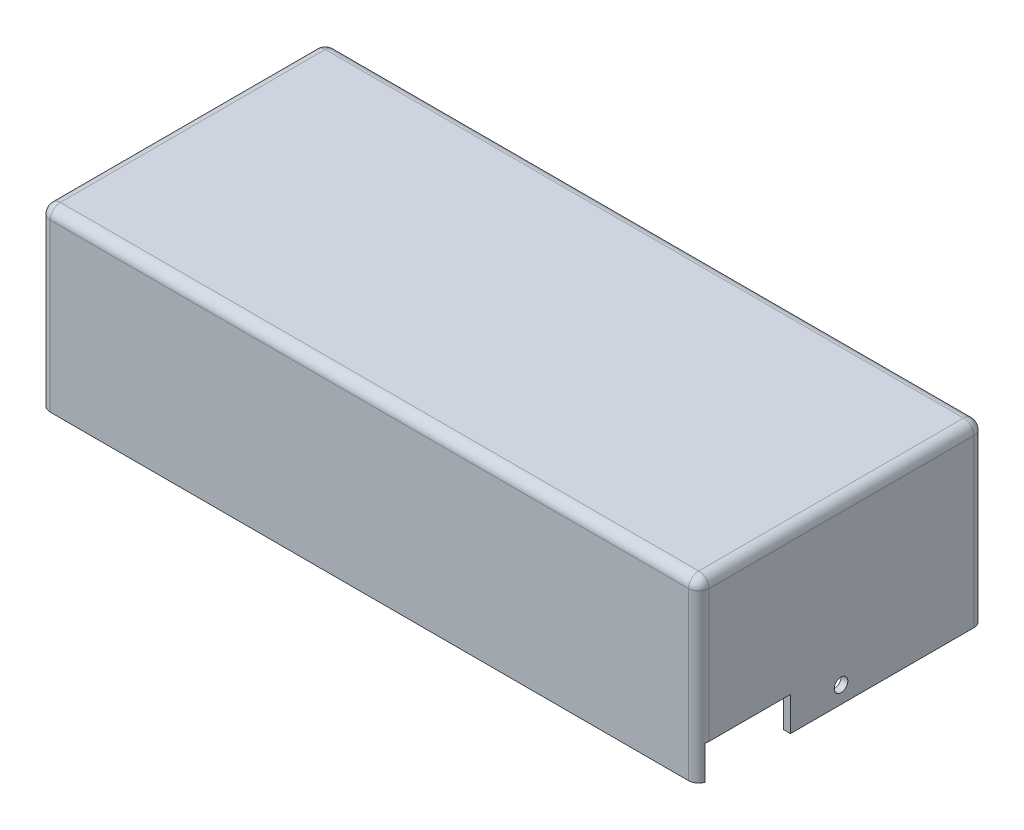
ISO-10303-21;
HEADER;
FILE_DESCRIPTION(('STEP AP214'),'2;1');
FILE_NAME('part.step','',(''),(''),'','','');
FILE_SCHEMA(('AUTOMOTIVE_DESIGN { 1 0 10303 214 1 1 1 1 }'));
ENDSEC;
DATA;
#1=APPLICATION_CONTEXT('core data for automotive mechanical design processes');
#2=APPLICATION_PROTOCOL_DEFINITION('international standard','automotive_design',2000,#1);
#3=PRODUCT_CONTEXT('',#1,'mechanical');
#4=PRODUCT('Part','Part','',(#3));
#5=PRODUCT_RELATED_PRODUCT_CATEGORY('part','',(#4));
#6=PRODUCT_DEFINITION_FORMATION('','',#4);
#7=PRODUCT_DEFINITION_CONTEXT('part definition',#1,'design');
#8=PRODUCT_DEFINITION('design','',#6,#7);
#9=PRODUCT_DEFINITION_SHAPE('','',#8);
#10=(LENGTH_UNIT() NAMED_UNIT(*) SI_UNIT(.MILLI.,.METRE.));
#11=(NAMED_UNIT(*) PLANE_ANGLE_UNIT() SI_UNIT($,.RADIAN.));
#12=(NAMED_UNIT(*) SI_UNIT($,.STERADIAN.) SOLID_ANGLE_UNIT());
#13=UNCERTAINTY_MEASURE_WITH_UNIT(LENGTH_MEASURE(1.E-05),#10,'distance_accuracy_value','');
#14=(GEOMETRIC_REPRESENTATION_CONTEXT(3) GLOBAL_UNCERTAINTY_ASSIGNED_CONTEXT((#13)) GLOBAL_UNIT_ASSIGNED_CONTEXT((#10,
#11,#12)) REPRESENTATION_CONTEXT('',''));
#15=CARTESIAN_POINT('',(0.,0.,0.));
#16=DIRECTION('',(0.,0.,1.));
#17=DIRECTION('',(1.,0.,0.));
#18=AXIS2_PLACEMENT_3D('',#15,#16,#17);
#19=CARTESIAN_POINT('',(0.,0.,84.));
#20=DIRECTION('',(1.,0.,0.));
#21=DIRECTION('',(0.,0.,-1.));
#22=AXIS2_PLACEMENT_3D('',#19,#20,#21);
#23=PLANE('',#22);
#24=CARTESIAN_POINT('',(0.,5.,41.8927201313068));
#25=DIRECTION('',(-1.,0.,0.));
#26=DIRECTION('',(0.,0.,1.));
#27=AXIS2_PLACEMENT_3D('',#24,#25,#26);
#28=CIRCLE('',#27,1.99999999999999);
#29=CARTESIAN_POINT('',(0.,5.,43.8927201313068));
#30=VERTEX_POINT('',#29);
#31=EDGE_CURVE('E431',#30,#30,#28,.T.);
#32=ORIENTED_EDGE('',*,*,#31,.F.);
#33=EDGE_LOOP('',(#32));
#34=FACE_BOUND('',#33,.T.);
#35=DIRECTION('',(0.,0.,-1.));
#36=VECTOR('',#35,1.);
#37=CARTESIAN_POINT('',(0.,49.,84.));
#38=LINE('',#37,#36);
#39=CARTESIAN_POINT('',(0.,49.,81.));
#40=VERTEX_POINT('',#39);
#41=CARTESIAN_POINT('',(0.,49.,3.));
#42=VERTEX_POINT('',#41);
#43=EDGE_CURVE('E71',#40,#42,#38,.T.);
#44=ORIENTED_EDGE('',*,*,#43,.T.);
#45=DIRECTION('',(0.,-1.,0.));
#46=VECTOR('',#45,1.);
#47=CARTESIAN_POINT('',(0.,0.,3.));
#48=LINE('',#47,#46);
#49=CARTESIAN_POINT('',(0.,0.,3.00000000000003));
#50=VERTEX_POINT('',#49);
#51=EDGE_CURVE('E400',#42,#50,#48,.T.);
#52=ORIENTED_EDGE('',*,*,#51,.T.);
#53=DIRECTION('',(0.,0.,-1.));
#54=VECTOR('',#53,1.);
#55=CARTESIAN_POINT('',(0.,0.,84.));
#56=LINE('',#55,#54);
#57=CARTESIAN_POINT('',(0.,0.,81.));
#58=VERTEX_POINT('',#57);
#59=EDGE_CURVE('E253',#58,#50,#56,.T.);
#60=ORIENTED_EDGE('',*,*,#59,.F.);
#61=DIRECTION('',(0.,-1.,0.));
#62=VECTOR('',#61,1.);
#63=CARTESIAN_POINT('',(0.,0.,81.));
#64=LINE('',#63,#62);
#65=EDGE_CURVE('E360',#58,#40,#64,.F.);
#66=ORIENTED_EDGE('',*,*,#65,.T.);
#67=EDGE_LOOP('',(#44,#52,#60,#66));
#68=FACE_BOUND('',#67,.T.);
#69=ADVANCED_FACE('F46',(#34,#68),#23,.F.);
#70=CARTESIAN_POINT('',(0.,0.,84.));
#71=DIRECTION('',(0.,1.,0.));
#72=DIRECTION('',(0.,0.,1.));
#73=AXIS2_PLACEMENT_3D('',#70,#71,#72);
#74=PLANE('',#73);
#75=DIRECTION('',(0.,0.,-1.));
#76=VECTOR('',#75,1.);
#77=CARTESIAN_POINT('',(194.,0.,84.));
#78=LINE('',#77,#76);
#79=CARTESIAN_POINT('',(194.,0.,57.));
#80=VERTEX_POINT('',#79);
#81=CARTESIAN_POINT('',(194.,0.,3.00000000000003));
#82=VERTEX_POINT('',#81);
#83=EDGE_CURVE('E249',#80,#82,#78,.T.);
#84=ORIENTED_EDGE('',*,*,#83,.F.);
#85=DIRECTION('',(1.,0.,0.));
#86=VECTOR('',#85,1.);
#87=CARTESIAN_POINT('',(189.,0.,57.));
#88=LINE('',#87,#86);
#89=CARTESIAN_POINT('',(192.,0.,57.));
#90=VERTEX_POINT('',#89);
#91=EDGE_CURVE('E214',#90,#80,#88,.T.);
#92=ORIENTED_EDGE('',*,*,#91,.F.);
#93=DIRECTION('',(0.,0.,1.));
#94=VECTOR('',#93,1.);
#95=CARTESIAN_POINT('',(192.,0.,2.));
#96=LINE('',#95,#94);
#97=CARTESIAN_POINT('',(192.,0.,3.));
#98=VERTEX_POINT('',#97);
#99=EDGE_CURVE('E234',#98,#90,#96,.T.);
#100=ORIENTED_EDGE('',*,*,#99,.F.);
#101=CARTESIAN_POINT('',(191.,0.,3.));
#102=DIRECTION('',(0.,1.,0.));
#103=DIRECTION('',(0.,0.,1.));
#104=AXIS2_PLACEMENT_3D('',#101,#102,#103);
#105=CIRCLE('',#104,1.);
#106=CARTESIAN_POINT('',(191.,0.,2.));
#107=VERTEX_POINT('',#106);
#108=EDGE_CURVE('E324',#98,#107,#105,.T.);
#109=ORIENTED_EDGE('',*,*,#108,.T.);
#110=DIRECTION('',(1.,0.,0.));
#111=VECTOR('',#110,1.);
#112=CARTESIAN_POINT('',(192.,0.,2.));
#113=LINE('',#112,#111);
#114=CARTESIAN_POINT('',(3.,0.,1.99999999999998));
#115=VERTEX_POINT('',#114);
#116=EDGE_CURVE('E242',#115,#107,#113,.T.);
#117=ORIENTED_EDGE('',*,*,#116,.F.);
#118=CARTESIAN_POINT('',(3.,0.,2.99999999999998));
#119=DIRECTION('',(0.,1.,0.));
#120=DIRECTION('',(0.,0.,1.));
#121=AXIS2_PLACEMENT_3D('',#118,#119,#120);
#122=CIRCLE('',#121,1.);
#123=CARTESIAN_POINT('',(2.,0.,2.99999999999998));
#124=VERTEX_POINT('',#123);
#125=EDGE_CURVE('E272',#115,#124,#122,.T.);
#126=ORIENTED_EDGE('',*,*,#125,.T.);
#127=DIRECTION('',(0.,0.,-1.));
#128=VECTOR('',#127,1.);
#129=CARTESIAN_POINT('',(2.,0.,1.99999999999998));
#130=LINE('',#129,#128);
#131=CARTESIAN_POINT('',(2.,0.,81.));
#132=VERTEX_POINT('',#131);
#133=EDGE_CURVE('E240',#132,#124,#130,.T.);
#134=ORIENTED_EDGE('',*,*,#133,.F.);
#135=CARTESIAN_POINT('',(3.,0.,81.));
#136=DIRECTION('',(0.,1.,0.));
#137=DIRECTION('',(0.,0.,1.));
#138=AXIS2_PLACEMENT_3D('',#135,#136,#137);
#139=CIRCLE('',#138,1.);
#140=CARTESIAN_POINT('',(3.,0.,82.));
#141=VERTEX_POINT('',#140);
#142=EDGE_CURVE('E296',#132,#141,#139,.T.);
#143=ORIENTED_EDGE('',*,*,#142,.T.);
#144=DIRECTION('',(-1.,0.,0.));
#145=VECTOR('',#144,1.);
#146=CARTESIAN_POINT('',(192.,0.,82.));
#147=LINE('',#146,#145);
#148=CARTESIAN_POINT('',(193.828427124746,0.,82.));
#149=VERTEX_POINT('',#148);
#150=EDGE_CURVE('E237',#149,#141,#147,.T.);
#151=ORIENTED_EDGE('',*,*,#150,.F.);
#152=CARTESIAN_POINT('',(191.,0.,81.));
#153=DIRECTION('',(0.,1.,0.));
#154=DIRECTION('',(0.,0.,1.));
#155=AXIS2_PLACEMENT_3D('',#152,#153,#154);
#156=CIRCLE('',#155,3.);
#157=CARTESIAN_POINT('',(191.,0.,84.));
#158=VERTEX_POINT('',#157);
#159=EDGE_CURVE('E357',#149,#158,#156,.F.);
#160=ORIENTED_EDGE('',*,*,#159,.T.);
#161=DIRECTION('',(1.,0.,0.));
#162=VECTOR('',#161,1.);
#163=CARTESIAN_POINT('',(0.,0.,84.));
#164=LINE('',#163,#162);
#165=CARTESIAN_POINT('',(3.,0.,84.));
#166=VERTEX_POINT('',#165);
#167=EDGE_CURVE('E246',#166,#158,#164,.T.);
#168=ORIENTED_EDGE('',*,*,#167,.F.);
#169=CARTESIAN_POINT('',(3.,0.,81.));
#170=DIRECTION('',(0.,1.,0.));
#171=DIRECTION('',(0.,0.,1.));
#172=AXIS2_PLACEMENT_3D('',#169,#170,#171);
#173=CIRCLE('',#172,3.);
#174=EDGE_CURVE('E355',#166,#58,#173,.F.);
#175=ORIENTED_EDGE('',*,*,#174,.T.);
#176=ORIENTED_EDGE('',*,*,#59,.T.);
#177=CARTESIAN_POINT('',(3.,0.,3.));
#178=DIRECTION('',(0.,1.,0.));
#179=DIRECTION('',(0.,0.,1.));
#180=AXIS2_PLACEMENT_3D('',#177,#178,#179);
#181=CIRCLE('',#180,3.);
#182=CARTESIAN_POINT('',(3.,0.,0.));
#183=VERTEX_POINT('',#182);
#184=EDGE_CURVE('E389',#50,#183,#181,.F.);
#185=ORIENTED_EDGE('',*,*,#184,.T.);
#186=DIRECTION('',(1.,0.,0.));
#187=VECTOR('',#186,1.);
#188=CARTESIAN_POINT('',(0.,0.,0.));
#189=LINE('',#188,#187);
#190=CARTESIAN_POINT('',(191.,0.,0.));
#191=VERTEX_POINT('',#190);
#192=EDGE_CURVE('E245',#183,#191,#189,.T.);
#193=ORIENTED_EDGE('',*,*,#192,.T.);
#194=CARTESIAN_POINT('',(191.,0.,3.));
#195=DIRECTION('',(0.,1.,0.));
#196=DIRECTION('',(0.,0.,1.));
#197=AXIS2_PLACEMENT_3D('',#194,#195,#196);
#198=CIRCLE('',#197,3.);
#199=EDGE_CURVE('E391',#191,#82,#198,.F.);
#200=ORIENTED_EDGE('',*,*,#199,.T.);
#201=EDGE_LOOP('',(#84,#92,#100,#109,#117,#126,#134,#143,#151,#160,#168,#175,#176,#185,#193,#200));
#202=FACE_BOUND('',#201,.T.);
#203=ADVANCED_FACE('F440',(#202),#74,.F.);
#204=CARTESIAN_POINT('',(194.,0.,84.));
#205=DIRECTION('',(-1.,0.,0.));
#206=DIRECTION('',(0.,0.,1.));
#207=AXIS2_PLACEMENT_3D('',#204,#205,#206);
#208=PLANE('',#207);
#209=CARTESIAN_POINT('',(194.,5.,42.1072798686932));
#210=DIRECTION('',(1.,0.,0.));
#211=DIRECTION('',(0.,0.,-1.));
#212=AXIS2_PLACEMENT_3D('',#209,#210,#211);
#213=CIRCLE('',#212,2.);
#214=CARTESIAN_POINT('',(194.,5.,40.1072798686932));
#215=VERTEX_POINT('',#214);
#216=EDGE_CURVE('E424',#215,#215,#213,.T.);
#217=ORIENTED_EDGE('',*,*,#216,.F.);
#218=EDGE_LOOP('',(#217));
#219=FACE_BOUND('',#218,.T.);
#220=DIRECTION('',(0.,0.,1.));
#221=VECTOR('',#220,1.);
#222=CARTESIAN_POINT('',(194.,10.,57.));
#223=LINE('',#222,#221);
#224=CARTESIAN_POINT('',(194.,10.,57.));
#225=VERTEX_POINT('',#224);
#226=CARTESIAN_POINT('',(194.,10.,81.));
#227=VERTEX_POINT('',#226);
#228=EDGE_CURVE('E63',#225,#227,#223,.T.);
#229=ORIENTED_EDGE('',*,*,#228,.F.);
#230=DIRECTION('',(0.,1.,0.));
#231=VECTOR('',#230,1.);
#232=CARTESIAN_POINT('',(194.,0.,57.));
#233=LINE('',#232,#231);
#234=EDGE_CURVE('E211',#80,#225,#233,.T.);
#235=ORIENTED_EDGE('',*,*,#234,.F.);
#236=ORIENTED_EDGE('',*,*,#83,.T.);
#237=DIRECTION('',(0.,1.,0.));
#238=VECTOR('',#237,1.);
#239=CARTESIAN_POINT('',(194.,49.,3.));
#240=LINE('',#239,#238);
#241=CARTESIAN_POINT('',(194.,49.,3.));
#242=VERTEX_POINT('',#241);
#243=EDGE_CURVE('E379',#82,#242,#240,.T.);
#244=ORIENTED_EDGE('',*,*,#243,.T.);
#245=DIRECTION('',(0.,0.,-1.));
#246=VECTOR('',#245,1.);
#247=CARTESIAN_POINT('',(194.,49.,84.));
#248=LINE('',#247,#246);
#249=CARTESIAN_POINT('',(194.,49.,81.));
#250=VERTEX_POINT('',#249);
#251=EDGE_CURVE('E345',#242,#250,#248,.F.);
#252=ORIENTED_EDGE('',*,*,#251,.T.);
#253=DIRECTION('',(0.,1.,0.));
#254=VECTOR('',#253,1.);
#255=CARTESIAN_POINT('',(194.,0.,81.));
#256=LINE('',#255,#254);
#257=EDGE_CURVE('E222',#250,#227,#256,.F.);
#258=ORIENTED_EDGE('',*,*,#257,.T.);
#259=EDGE_LOOP('',(#229,#235,#236,#244,#252,#258));
#260=FACE_BOUND('',#259,.T.);
#261=ADVANCED_FACE('F220',(#219,#260),#208,.F.);
#262=CARTESIAN_POINT('',(0.,52.,84.));
#263=DIRECTION('',(0.,-1.,0.));
#264=DIRECTION('',(0.,0.,-1.));
#265=AXIS2_PLACEMENT_3D('',#262,#263,#264);
#266=PLANE('',#265);
#267=DIRECTION('',(0.,0.,-1.));
#268=VECTOR('',#267,1.);
#269=CARTESIAN_POINT('',(191.,52.,84.));
#270=LINE('',#269,#268);
#271=CARTESIAN_POINT('',(191.,52.,81.));
#272=VERTEX_POINT('',#271);
#273=CARTESIAN_POINT('',(191.,52.,3.));
#274=VERTEX_POINT('',#273);
#275=EDGE_CURVE('E340',#272,#274,#270,.T.);
#276=ORIENTED_EDGE('',*,*,#275,.T.);
#277=DIRECTION('',(-1.,0.,0.));
#278=VECTOR('',#277,1.);
#279=CARTESIAN_POINT('',(0.,52.,3.));
#280=LINE('',#279,#278);
#281=CARTESIAN_POINT('',(3.,52.,3.));
#282=VERTEX_POINT('',#281);
#283=EDGE_CURVE('E397',#274,#282,#280,.T.);
#284=ORIENTED_EDGE('',*,*,#283,.T.);
#285=DIRECTION('',(0.,0.,-1.));
#286=VECTOR('',#285,1.);
#287=CARTESIAN_POINT('',(3.,52.,84.));
#288=LINE('',#287,#286);
#289=CARTESIAN_POINT('',(3.,52.,81.));
#290=VERTEX_POINT('',#289);
#291=EDGE_CURVE('E395',#282,#290,#288,.F.);
#292=ORIENTED_EDGE('',*,*,#291,.T.);
#293=DIRECTION('',(-1.,0.,0.));
#294=VECTOR('',#293,1.);
#295=CARTESIAN_POINT('',(0.,52.,81.));
#296=LINE('',#295,#294);
#297=EDGE_CURVE('E326',#290,#272,#296,.F.);
#298=ORIENTED_EDGE('',*,*,#297,.T.);
#299=EDGE_LOOP('',(#276,#284,#292,#298));
#300=FACE_BOUND('',#299,.T.);
#301=ADVANCED_FACE('F586',(#300),#266,.F.);
#302=CARTESIAN_POINT('',(0.,0.,84.));
#303=DIRECTION('',(0.,0.,-1.));
#304=DIRECTION('',(-1.,0.,0.));
#305=AXIS2_PLACEMENT_3D('',#302,#303,#304);
#306=PLANE('',#305);
#307=ORIENTED_EDGE('',*,*,#167,.T.);
#308=DIRECTION('',(0.,1.,0.));
#309=VECTOR('',#308,1.);
#310=CARTESIAN_POINT('',(191.,0.,84.));
#311=LINE('',#310,#309);
#312=CARTESIAN_POINT('',(191.,49.,84.));
#313=VERTEX_POINT('',#312);
#314=EDGE_CURVE('E352',#158,#313,#311,.T.);
#315=ORIENTED_EDGE('',*,*,#314,.T.);
#316=DIRECTION('',(-1.,0.,0.));
#317=VECTOR('',#316,1.);
#318=CARTESIAN_POINT('',(0.,49.,84.));
#319=LINE('',#318,#317);
#320=CARTESIAN_POINT('',(3.,49.,84.));
#321=VERTEX_POINT('',#320);
#322=EDGE_CURVE('E347',#313,#321,#319,.T.);
#323=ORIENTED_EDGE('',*,*,#322,.T.);
#324=DIRECTION('',(0.,-1.,0.));
#325=VECTOR('',#324,1.);
#326=CARTESIAN_POINT('',(3.,0.,84.));
#327=LINE('',#326,#325);
#328=EDGE_CURVE('E350',#321,#166,#327,.T.);
#329=ORIENTED_EDGE('',*,*,#328,.T.);
#330=EDGE_LOOP('',(#307,#315,#323,#329));
#331=FACE_BOUND('',#330,.T.);
#332=ADVANCED_FACE('F560',(#331),#306,.F.);
#333=CARTESIAN_POINT('',(0.,0.,0.));
#334=DIRECTION('',(0.,0.,-1.));
#335=DIRECTION('',(-1.,0.,0.));
#336=AXIS2_PLACEMENT_3D('',#333,#334,#335);
#337=PLANE('',#336);
#338=DIRECTION('',(-1.,0.,0.));
#339=VECTOR('',#338,1.);
#340=CARTESIAN_POINT('',(191.,49.,0.));
#341=LINE('',#340,#339);
#342=CARTESIAN_POINT('',(3.,49.,0.));
#343=VERTEX_POINT('',#342);
#344=CARTESIAN_POINT('',(191.,49.,0.));
#345=VERTEX_POINT('',#344);
#346=EDGE_CURVE('E384',#343,#345,#341,.F.);
#347=ORIENTED_EDGE('',*,*,#346,.T.);
#348=DIRECTION('',(0.,1.,0.));
#349=VECTOR('',#348,1.);
#350=CARTESIAN_POINT('',(191.,0.,0.));
#351=LINE('',#350,#349);
#352=EDGE_CURVE('E386',#345,#191,#351,.F.);
#353=ORIENTED_EDGE('',*,*,#352,.T.);
#354=ORIENTED_EDGE('',*,*,#192,.F.);
#355=DIRECTION('',(0.,-1.,0.));
#356=VECTOR('',#355,1.);
#357=CARTESIAN_POINT('',(3.,52.,0.));
#358=LINE('',#357,#356);
#359=EDGE_CURVE('E382',#183,#343,#358,.F.);
#360=ORIENTED_EDGE('',*,*,#359,.T.);
#361=EDGE_LOOP('',(#347,#353,#354,#360));
#362=FACE_BOUND('',#361,.T.);
#363=ADVANCED_FACE('F575',(#362),#337,.T.);
#364=CARTESIAN_POINT('',(192.,50.,2.));
#365=DIRECTION('',(1.,0.,0.));
#366=DIRECTION('',(0.,0.,-1.));
#367=AXIS2_PLACEMENT_3D('',#364,#365,#366);
#368=PLANE('',#367);
#369=CARTESIAN_POINT('',(192.,5.,42.1072798686932));
#370=DIRECTION('',(1.,0.,0.));
#371=DIRECTION('',(0.,0.,-1.));
#372=AXIS2_PLACEMENT_3D('',#369,#370,#371);
#373=CIRCLE('',#372,2.);
#374=CARTESIAN_POINT('',(192.,5.,40.1072798686932));
#375=VERTEX_POINT('',#374);
#376=EDGE_CURVE('E217',#375,#375,#373,.T.);
#377=ORIENTED_EDGE('',*,*,#376,.T.);
#378=EDGE_LOOP('',(#377));
#379=FACE_BOUND('',#378,.T.);
#380=ORIENTED_EDGE('',*,*,#99,.T.);
#381=DIRECTION('',(0.,1.,0.));
#382=VECTOR('',#381,1.);
#383=CARTESIAN_POINT('',(192.,50.,57.));
#384=LINE('',#383,#382);
#385=CARTESIAN_POINT('',(192.,10.,57.));
#386=VERTEX_POINT('',#385);
#387=EDGE_CURVE('E11',#90,#386,#384,.T.);
#388=ORIENTED_EDGE('',*,*,#387,.T.);
#389=DIRECTION('',(0.,0.,1.));
#390=VECTOR('',#389,1.);
#391=CARTESIAN_POINT('',(192.,10.,1.99999999999999));
#392=LINE('',#391,#390);
#393=CARTESIAN_POINT('',(192.,10.,81.));
#394=VERTEX_POINT('',#393);
#395=EDGE_CURVE('E206',#386,#394,#392,.T.);
#396=ORIENTED_EDGE('',*,*,#395,.T.);
#397=DIRECTION('',(0.,-1.,0.));
#398=VECTOR('',#397,1.);
#399=CARTESIAN_POINT('',(192.,49.,81.));
#400=LINE('',#399,#398);
#401=CARTESIAN_POINT('',(192.,49.,81.));
#402=VERTEX_POINT('',#401);
#403=EDGE_CURVE('E299',#394,#402,#400,.F.);
#404=ORIENTED_EDGE('',*,*,#403,.T.);
#405=DIRECTION('',(0.,0.,1.));
#406=VECTOR('',#405,1.);
#407=CARTESIAN_POINT('',(192.,49.,2.));
#408=LINE('',#407,#406);
#409=CARTESIAN_POINT('',(192.,49.,3.));
#410=VERTEX_POINT('',#409);
#411=EDGE_CURVE('E307',#402,#410,#408,.F.);
#412=ORIENTED_EDGE('',*,*,#411,.T.);
#413=DIRECTION('',(0.,-1.,0.));
#414=VECTOR('',#413,1.);
#415=CARTESIAN_POINT('',(192.,0.,3.));
#416=LINE('',#415,#414);
#417=EDGE_CURVE('E309',#410,#98,#416,.T.);
#418=ORIENTED_EDGE('',*,*,#417,.T.);
#419=EDGE_LOOP('',(#380,#388,#396,#404,#412,#418));
#420=FACE_BOUND('',#419,.T.);
#421=ADVANCED_FACE('F602',(#379,#420),#368,.F.);
#422=CARTESIAN_POINT('',(192.,50.,2.));
#423=DIRECTION('',(0.,0.,-1.));
#424=DIRECTION('',(-1.,0.,0.));
#425=AXIS2_PLACEMENT_3D('',#422,#423,#424);
#426=PLANE('',#425);
#427=ORIENTED_EDGE('',*,*,#116,.T.);
#428=DIRECTION('',(0.,-1.,0.));
#429=VECTOR('',#428,1.);
#430=CARTESIAN_POINT('',(191.,49.,2.));
#431=LINE('',#430,#429);
#432=CARTESIAN_POINT('',(191.,49.,2.));
#433=VERTEX_POINT('',#432);
#434=EDGE_CURVE('E312',#107,#433,#431,.F.);
#435=ORIENTED_EDGE('',*,*,#434,.T.);
#436=DIRECTION('',(1.,0.,0.));
#437=VECTOR('',#436,1.);
#438=CARTESIAN_POINT('',(192.,49.,2.));
#439=LINE('',#438,#437);
#440=CARTESIAN_POINT('',(3.,49.,1.99999999999998));
#441=VERTEX_POINT('',#440);
#442=EDGE_CURVE('E264',#433,#441,#439,.F.);
#443=ORIENTED_EDGE('',*,*,#442,.T.);
#444=DIRECTION('',(0.,-1.,0.));
#445=VECTOR('',#444,1.);
#446=CARTESIAN_POINT('',(3.,0.,1.99999999999998));
#447=LINE('',#446,#445);
#448=EDGE_CURVE('E262',#441,#115,#447,.T.);
#449=ORIENTED_EDGE('',*,*,#448,.T.);
#450=EDGE_LOOP('',(#427,#435,#443,#449));
#451=FACE_BOUND('',#450,.T.);
#452=ADVANCED_FACE('F608',(#451),#426,.F.);
#453=CARTESIAN_POINT('',(2.,50.,1.99999999999998));
#454=DIRECTION('',(-1.,0.,0.));
#455=DIRECTION('',(0.,0.,1.));
#456=AXIS2_PLACEMENT_3D('',#453,#454,#455);
#457=PLANE('',#456);
#458=CARTESIAN_POINT('',(2.,5.,41.8927201313068));
#459=DIRECTION('',(-1.,0.,0.));
#460=DIRECTION('',(0.,0.,1.));
#461=AXIS2_PLACEMENT_3D('',#458,#459,#460);
#462=CIRCLE('',#461,1.99999999999999);
#463=CARTESIAN_POINT('',(2.,5.,43.8927201313068));
#464=VERTEX_POINT('',#463);
#465=EDGE_CURVE('E50',#464,#464,#462,.T.);
#466=ORIENTED_EDGE('',*,*,#465,.T.);
#467=EDGE_LOOP('',(#466));
#468=FACE_BOUND('',#467,.T.);
#469=DIRECTION('',(0.,0.,-1.));
#470=VECTOR('',#469,1.);
#471=CARTESIAN_POINT('',(2.,49.,1.99999999999998));
#472=LINE('',#471,#470);
#473=CARTESIAN_POINT('',(2.,49.,2.99999999999998));
#474=VERTEX_POINT('',#473);
#475=CARTESIAN_POINT('',(2.,49.,81.));
#476=VERTEX_POINT('',#475);
#477=EDGE_CURVE('E267',#474,#476,#472,.F.);
#478=ORIENTED_EDGE('',*,*,#477,.T.);
#479=DIRECTION('',(0.,-1.,0.));
#480=VECTOR('',#479,1.);
#481=CARTESIAN_POINT('',(2.,0.,81.));
#482=LINE('',#481,#480);
#483=EDGE_CURVE('E294',#476,#132,#482,.T.);
#484=ORIENTED_EDGE('',*,*,#483,.T.);
#485=ORIENTED_EDGE('',*,*,#133,.T.);
#486=DIRECTION('',(0.,-1.,0.));
#487=VECTOR('',#486,1.);
#488=CARTESIAN_POINT('',(2.,50.,2.99999999999998));
#489=LINE('',#488,#487);
#490=EDGE_CURVE('E270',#124,#474,#489,.F.);
#491=ORIENTED_EDGE('',*,*,#490,.T.);
#492=EDGE_LOOP('',(#478,#484,#485,#491));
#493=FACE_BOUND('',#492,.T.);
#494=ADVANCED_FACE('F629',(#468,#493),#457,.F.);
#495=CARTESIAN_POINT('',(192.,50.,82.));
#496=DIRECTION('',(0.,0.,1.));
#497=DIRECTION('',(1.,0.,0.));
#498=AXIS2_PLACEMENT_3D('',#495,#496,#497);
#499=PLANE('',#498);
#500=DIRECTION('',(0.,-1.,0.));
#501=VECTOR('',#500,1.);
#502=CARTESIAN_POINT('',(191.,0.,82.));
#503=LINE('',#502,#501);
#504=CARTESIAN_POINT('',(191.,49.,82.));
#505=VERTEX_POINT('',#504);
#506=CARTESIAN_POINT('',(191.,10.,82.));
#507=VERTEX_POINT('',#506);
#508=EDGE_CURVE('E321',#505,#507,#503,.T.);
#509=ORIENTED_EDGE('',*,*,#508,.T.);
#510=DIRECTION('',(1.,0.,0.));
#511=VECTOR('',#510,1.);
#512=CARTESIAN_POINT('',(189.,10.,82.));
#513=LINE('',#512,#511);
#514=CARTESIAN_POINT('',(193.828427124746,10.,82.));
#515=VERTEX_POINT('',#514);
#516=EDGE_CURVE('E208',#507,#515,#513,.T.);
#517=ORIENTED_EDGE('',*,*,#516,.T.);
#518=DIRECTION('',(0.,1.,0.));
#519=VECTOR('',#518,1.);
#520=CARTESIAN_POINT('',(193.828427124746,0.,82.));
#521=LINE('',#520,#519);
#522=EDGE_CURVE('E55',#515,#149,#521,.F.);
#523=ORIENTED_EDGE('',*,*,#522,.T.);
#524=ORIENTED_EDGE('',*,*,#150,.T.);
#525=DIRECTION('',(0.,-1.,0.));
#526=VECTOR('',#525,1.);
#527=CARTESIAN_POINT('',(3.,49.,82.));
#528=LINE('',#527,#526);
#529=CARTESIAN_POINT('',(3.,49.,82.));
#530=VERTEX_POINT('',#529);
#531=EDGE_CURVE('E287',#141,#530,#528,.F.);
#532=ORIENTED_EDGE('',*,*,#531,.T.);
#533=DIRECTION('',(-1.,0.,0.));
#534=VECTOR('',#533,1.);
#535=CARTESIAN_POINT('',(192.,49.,82.));
#536=LINE('',#535,#534);
#537=EDGE_CURVE('E289',#530,#505,#536,.F.);
#538=ORIENTED_EDGE('',*,*,#537,.T.);
#539=EDGE_LOOP('',(#509,#517,#523,#524,#532,#538));
#540=FACE_BOUND('',#539,.T.);
#541=ADVANCED_FACE('F590',(#540),#499,.F.);
#542=CARTESIAN_POINT('',(0.,50.,0.));
#543=DIRECTION('',(0.,-1.,0.));
#544=DIRECTION('',(0.,0.,-1.));
#545=AXIS2_PLACEMENT_3D('',#542,#543,#544);
#546=PLANE('',#545);
#547=DIRECTION('',(1.,0.,0.));
#548=VECTOR('',#547,1.);
#549=CARTESIAN_POINT('',(0.,50.,2.99999999999998));
#550=LINE('',#549,#548);
#551=CARTESIAN_POINT('',(3.,50.,2.99999999999998));
#552=VERTEX_POINT('',#551);
#553=CARTESIAN_POINT('',(191.,50.,3.));
#554=VERTEX_POINT('',#553);
#555=EDGE_CURVE('E258',#552,#554,#550,.T.);
#556=ORIENTED_EDGE('',*,*,#555,.T.);
#557=DIRECTION('',(0.,0.,1.));
#558=VECTOR('',#557,1.);
#559=CARTESIAN_POINT('',(191.,50.,0.));
#560=LINE('',#559,#558);
#561=CARTESIAN_POINT('',(191.,50.,81.));
#562=VERTEX_POINT('',#561);
#563=EDGE_CURVE('E317',#554,#562,#560,.T.);
#564=ORIENTED_EDGE('',*,*,#563,.T.);
#565=DIRECTION('',(-1.,0.,0.));
#566=VECTOR('',#565,1.);
#567=CARTESIAN_POINT('',(0.,50.,81.));
#568=LINE('',#567,#566);
#569=CARTESIAN_POINT('',(3.,50.,81.));
#570=VERTEX_POINT('',#569);
#571=EDGE_CURVE('E275',#562,#570,#568,.T.);
#572=ORIENTED_EDGE('',*,*,#571,.T.);
#573=DIRECTION('',(0.,0.,-1.));
#574=VECTOR('',#573,1.);
#575=CARTESIAN_POINT('',(3.,50.,0.));
#576=LINE('',#575,#574);
#577=EDGE_CURVE('E256',#570,#552,#576,.T.);
#578=ORIENTED_EDGE('',*,*,#577,.T.);
#579=EDGE_LOOP('',(#556,#564,#572,#578));
#580=FACE_BOUND('',#579,.T.);
#581=ADVANCED_FACE('F468',(#580),#546,.T.);
#582=CARTESIAN_POINT('',(3.,50.,2.99999999999998));
#583=DIRECTION('',(0.,1.,0.));
#584=DIRECTION('',(0.,0.,1.));
#585=AXIS2_PLACEMENT_3D('',#582,#583,#584);
#586=CYLINDRICAL_SURFACE('',#585,1.);
#587=ORIENTED_EDGE('',*,*,#125,.F.);
#588=ORIENTED_EDGE('',*,*,#448,.F.);
#589=CARTESIAN_POINT('',(3.,49.,2.99999999999998));
#590=DIRECTION('',(0.,-1.,0.));
#591=DIRECTION('',(0.,0.,-1.));
#592=AXIS2_PLACEMENT_3D('',#589,#590,#591);
#593=CIRCLE('',#592,1.);
#594=EDGE_CURVE('E238',#474,#441,#593,.T.);
#595=ORIENTED_EDGE('',*,*,#594,.F.);
#596=ORIENTED_EDGE('',*,*,#490,.F.);
#597=EDGE_LOOP('',(#587,#588,#595,#596));
#598=FACE_BOUND('',#597,.T.);
#599=ADVANCED_FACE('F464',(#598),#586,.F.);
#600=CARTESIAN_POINT('',(3.,49.,0.));
#601=DIRECTION('',(0.,0.,-1.));
#602=DIRECTION('',(-1.,0.,0.));
#603=AXIS2_PLACEMENT_3D('',#600,#601,#602);
#604=CYLINDRICAL_SURFACE('',#603,1.);
#605=ORIENTED_EDGE('',*,*,#577,.F.);
#606=CARTESIAN_POINT('',(3.,49.,81.));
#607=DIRECTION('',(0.,0.,-1.));
#608=DIRECTION('',(-1.,0.,0.));
#609=AXIS2_PLACEMENT_3D('',#606,#607,#608);
#610=CIRCLE('',#609,1.);
#611=EDGE_CURVE('E292',#570,#476,#610,.F.);
#612=ORIENTED_EDGE('',*,*,#611,.T.);
#613=ORIENTED_EDGE('',*,*,#477,.F.);
#614=CARTESIAN_POINT('',(3.,49.,2.99999999999998));
#615=DIRECTION('',(0.,0.,1.));
#616=DIRECTION('',(1.,0.,0.));
#617=AXIS2_PLACEMENT_3D('',#614,#615,#616);
#618=CIRCLE('',#617,1.);
#619=EDGE_CURVE('E280',#552,#474,#618,.T.);
#620=ORIENTED_EDGE('',*,*,#619,.F.);
#621=EDGE_LOOP('',(#605,#612,#613,#620));
#622=FACE_BOUND('',#621,.T.);
#623=ADVANCED_FACE('F460',(#622),#604,.F.);
#624=CARTESIAN_POINT('',(3.,49.,2.99999999999998));
#625=DIRECTION('',(0.,0.,1.));
#626=DIRECTION('',(1.,0.,0.));
#627=AXIS2_PLACEMENT_3D('',#624,#625,#626);
#628=SPHERICAL_SURFACE('',#627,1.);
#629=ORIENTED_EDGE('',*,*,#619,.T.);
#630=ORIENTED_EDGE('',*,*,#594,.T.);
#631=CARTESIAN_POINT('',(3.,49.,2.99999999999998));
#632=DIRECTION('',(1.,0.,0.));
#633=DIRECTION('',(0.,0.,-1.));
#634=AXIS2_PLACEMENT_3D('',#631,#632,#633);
#635=CIRCLE('',#634,1.);
#636=EDGE_CURVE('E276',#552,#441,#635,.F.);
#637=ORIENTED_EDGE('',*,*,#636,.F.);
#638=EDGE_LOOP('',(#629,#630,#637));
#639=FACE_BOUND('',#638,.T.);
#640=ADVANCED_FACE('F456',(#639),#628,.F.);
#641=CARTESIAN_POINT('',(0.,49.,2.99999999999998));
#642=DIRECTION('',(1.,0.,0.));
#643=DIRECTION('',(0.,0.,-1.));
#644=AXIS2_PLACEMENT_3D('',#641,#642,#643);
#645=CYLINDRICAL_SURFACE('',#644,1.);
#646=ORIENTED_EDGE('',*,*,#442,.F.);
#647=CARTESIAN_POINT('',(191.,49.,3.));
#648=DIRECTION('',(1.,0.,0.));
#649=DIRECTION('',(0.,0.,-1.));
#650=AXIS2_PLACEMENT_3D('',#647,#648,#649);
#651=CIRCLE('',#650,1.);
#652=EDGE_CURVE('E314',#433,#554,#651,.T.);
#653=ORIENTED_EDGE('',*,*,#652,.T.);
#654=ORIENTED_EDGE('',*,*,#555,.F.);
#655=ORIENTED_EDGE('',*,*,#636,.T.);
#656=EDGE_LOOP('',(#646,#653,#654,#655));
#657=FACE_BOUND('',#656,.T.);
#658=ADVANCED_FACE('F450',(#657),#645,.F.);
#659=CARTESIAN_POINT('',(3.,50.,81.));
#660=DIRECTION('',(0.,1.,0.));
#661=DIRECTION('',(0.,0.,1.));
#662=AXIS2_PLACEMENT_3D('',#659,#660,#661);
#663=CYLINDRICAL_SURFACE('',#662,1.);
#664=ORIENTED_EDGE('',*,*,#142,.F.);
#665=ORIENTED_EDGE('',*,*,#483,.F.);
#666=CARTESIAN_POINT('',(3.,49.,81.));
#667=DIRECTION('',(0.,-1.,0.));
#668=DIRECTION('',(0.,0.,-1.));
#669=AXIS2_PLACEMENT_3D('',#666,#667,#668);
#670=CIRCLE('',#669,1.);
#671=EDGE_CURVE('E281',#530,#476,#670,.T.);
#672=ORIENTED_EDGE('',*,*,#671,.F.);
#673=ORIENTED_EDGE('',*,*,#531,.F.);
#674=EDGE_LOOP('',(#664,#665,#672,#673));
#675=FACE_BOUND('',#674,.T.);
#676=ADVANCED_FACE('F455',(#675),#663,.F.);
#677=CARTESIAN_POINT('',(3.,49.,81.));
#678=DIRECTION('',(0.,0.,1.));
#679=DIRECTION('',(1.,0.,0.));
#680=AXIS2_PLACEMENT_3D('',#677,#678,#679);
#681=SPHERICAL_SURFACE('',#680,1.);
#682=ORIENTED_EDGE('',*,*,#671,.T.);
#683=ORIENTED_EDGE('',*,*,#611,.F.);
#684=CARTESIAN_POINT('',(3.,49.,81.));
#685=DIRECTION('',(-1.,0.,0.));
#686=DIRECTION('',(0.,0.,1.));
#687=AXIS2_PLACEMENT_3D('',#684,#685,#686);
#688=CIRCLE('',#687,1.);
#689=EDGE_CURVE('E300',#530,#570,#688,.T.);
#690=ORIENTED_EDGE('',*,*,#689,.F.);
#691=EDGE_LOOP('',(#682,#683,#690));
#692=FACE_BOUND('',#691,.T.);
#693=ADVANCED_FACE('F474',(#692),#681,.F.);
#694=CARTESIAN_POINT('',(0.,49.,81.));
#695=DIRECTION('',(-1.,0.,0.));
#696=DIRECTION('',(0.,0.,1.));
#697=AXIS2_PLACEMENT_3D('',#694,#695,#696);
#698=CYLINDRICAL_SURFACE('',#697,1.);
#699=ORIENTED_EDGE('',*,*,#571,.F.);
#700=CARTESIAN_POINT('',(191.,49.,81.));
#701=DIRECTION('',(-1.,0.,0.));
#702=DIRECTION('',(0.,0.,1.));
#703=AXIS2_PLACEMENT_3D('',#700,#701,#702);
#704=CIRCLE('',#703,1.);
#705=EDGE_CURVE('E319',#562,#505,#704,.F.);
#706=ORIENTED_EDGE('',*,*,#705,.T.);
#707=ORIENTED_EDGE('',*,*,#537,.F.);
#708=ORIENTED_EDGE('',*,*,#689,.T.);
#709=EDGE_LOOP('',(#699,#706,#707,#708));
#710=FACE_BOUND('',#709,.T.);
#711=ADVANCED_FACE('F470',(#710),#698,.F.);
#712=CARTESIAN_POINT('',(191.,50.,81.));
#713=DIRECTION('',(0.,1.,0.));
#714=DIRECTION('',(0.,0.,1.));
#715=AXIS2_PLACEMENT_3D('',#712,#713,#714);
#716=CYLINDRICAL_SURFACE('',#715,1.);
#717=ORIENTED_EDGE('',*,*,#403,.F.);
#718=CARTESIAN_POINT('',(191.,10.,81.));
#719=DIRECTION('',(0.,1.,0.));
#720=DIRECTION('',(0.,0.,1.));
#721=AXIS2_PLACEMENT_3D('',#718,#719,#720);
#722=CIRCLE('',#721,1.);
#723=EDGE_CURVE('E227',#394,#507,#722,.F.);
#724=ORIENTED_EDGE('',*,*,#723,.T.);
#725=ORIENTED_EDGE('',*,*,#508,.F.);
#726=CARTESIAN_POINT('',(191.,49.,81.));
#727=DIRECTION('',(0.,-1.,0.));
#728=DIRECTION('',(0.,0.,-1.));
#729=AXIS2_PLACEMENT_3D('',#726,#727,#728);
#730=CIRCLE('',#729,1.);
#731=EDGE_CURVE('E303',#402,#505,#730,.T.);
#732=ORIENTED_EDGE('',*,*,#731,.F.);
#733=EDGE_LOOP('',(#717,#724,#725,#732));
#734=FACE_BOUND('',#733,.T.);
#735=ADVANCED_FACE('F473',(#734),#716,.F.);
#736=CARTESIAN_POINT('',(191.,49.,81.));
#737=DIRECTION('',(1.,0.,0.));
#738=DIRECTION('',(0.,0.,-1.));
#739=AXIS2_PLACEMENT_3D('',#736,#737,#738);
#740=SPHERICAL_SURFACE('',#739,1.);
#741=ORIENTED_EDGE('',*,*,#731,.T.);
#742=ORIENTED_EDGE('',*,*,#705,.F.);
#743=CARTESIAN_POINT('',(191.,49.,81.));
#744=DIRECTION('',(0.,0.,1.));
#745=DIRECTION('',(1.,0.,0.));
#746=AXIS2_PLACEMENT_3D('',#743,#744,#745);
#747=CIRCLE('',#746,1.);
#748=EDGE_CURVE('E334',#402,#562,#747,.T.);
#749=ORIENTED_EDGE('',*,*,#748,.F.);
#750=EDGE_LOOP('',(#741,#742,#749));
#751=FACE_BOUND('',#750,.T.);
#752=ADVANCED_FACE('F494',(#751),#740,.F.);
#753=CARTESIAN_POINT('',(191.,49.,0.));
#754=DIRECTION('',(0.,0.,1.));
#755=DIRECTION('',(1.,0.,0.));
#756=AXIS2_PLACEMENT_3D('',#753,#754,#755);
#757=CYLINDRICAL_SURFACE('',#756,1.);
#758=ORIENTED_EDGE('',*,*,#748,.T.);
#759=ORIENTED_EDGE('',*,*,#563,.F.);
#760=CARTESIAN_POINT('',(191.,49.,3.));
#761=DIRECTION('',(0.,0.,1.));
#762=DIRECTION('',(1.,0.,0.));
#763=AXIS2_PLACEMENT_3D('',#760,#761,#762);
#764=CIRCLE('',#763,1.);
#765=EDGE_CURVE('E330',#410,#554,#764,.T.);
#766=ORIENTED_EDGE('',*,*,#765,.F.);
#767=ORIENTED_EDGE('',*,*,#411,.F.);
#768=EDGE_LOOP('',(#758,#759,#766,#767));
#769=FACE_BOUND('',#768,.T.);
#770=ADVANCED_FACE('F490',(#769),#757,.F.);
#771=CARTESIAN_POINT('',(191.,49.,3.));
#772=DIRECTION('',(1.,0.,0.));
#773=DIRECTION('',(0.,0.,-1.));
#774=AXIS2_PLACEMENT_3D('',#771,#772,#773);
#775=SPHERICAL_SURFACE('',#774,1.);
#776=ORIENTED_EDGE('',*,*,#765,.T.);
#777=ORIENTED_EDGE('',*,*,#652,.F.);
#778=CARTESIAN_POINT('',(191.,49.,3.));
#779=DIRECTION('',(0.,1.,0.));
#780=DIRECTION('',(0.,0.,1.));
#781=AXIS2_PLACEMENT_3D('',#778,#779,#780);
#782=CIRCLE('',#781,1.);
#783=EDGE_CURVE('E327',#410,#433,#782,.T.);
#784=ORIENTED_EDGE('',*,*,#783,.F.);
#785=EDGE_LOOP('',(#776,#777,#784));
#786=FACE_BOUND('',#785,.T.);
#787=ADVANCED_FACE('F486',(#786),#775,.F.);
#788=CARTESIAN_POINT('',(191.,50.,3.));
#789=DIRECTION('',(0.,1.,0.));
#790=DIRECTION('',(0.,0.,1.));
#791=AXIS2_PLACEMENT_3D('',#788,#789,#790);
#792=CYLINDRICAL_SURFACE('',#791,1.);
#793=ORIENTED_EDGE('',*,*,#783,.T.);
#794=ORIENTED_EDGE('',*,*,#434,.F.);
#795=ORIENTED_EDGE('',*,*,#108,.F.);
#796=ORIENTED_EDGE('',*,*,#417,.F.);
#797=EDGE_LOOP('',(#793,#794,#795,#796));
#798=FACE_BOUND('',#797,.T.);
#799=ADVANCED_FACE('F482',(#798),#792,.F.);
#800=CARTESIAN_POINT('',(3.,0.,81.));
#801=DIRECTION('',(0.,-1.,0.));
#802=DIRECTION('',(0.,0.,-1.));
#803=AXIS2_PLACEMENT_3D('',#800,#801,#802);
#804=CYLINDRICAL_SURFACE('',#803,3.);
#805=ORIENTED_EDGE('',*,*,#328,.F.);
#806=CARTESIAN_POINT('',(3.,49.,81.));
#807=DIRECTION('',(0.,-1.,0.));
#808=DIRECTION('',(0.,0.,-1.));
#809=AXIS2_PLACEMENT_3D('',#806,#807,#808);
#810=CIRCLE('',#809,3.);
#811=EDGE_CURVE('E377',#321,#40,#810,.T.);
#812=ORIENTED_EDGE('',*,*,#811,.T.);
#813=ORIENTED_EDGE('',*,*,#65,.F.);
#814=ORIENTED_EDGE('',*,*,#174,.F.);
#815=EDGE_LOOP('',(#805,#812,#813,#814));
#816=FACE_BOUND('',#815,.T.);
#817=ADVANCED_FACE('F485',(#816),#804,.T.);
#818=CARTESIAN_POINT('',(191.,0.,81.));
#819=DIRECTION('',(0.,1.,0.));
#820=DIRECTION('',(0.,0.,1.));
#821=AXIS2_PLACEMENT_3D('',#818,#819,#820);
#822=CYLINDRICAL_SURFACE('',#821,3.);
#823=ORIENTED_EDGE('',*,*,#522,.F.);
#824=CARTESIAN_POINT('',(191.,10.,81.));
#825=DIRECTION('',(0.,1.,0.));
#826=DIRECTION('',(0.,0.,1.));
#827=AXIS2_PLACEMENT_3D('',#824,#825,#826);
#828=CIRCLE('',#827,3.);
#829=EDGE_CURVE('E402',#227,#515,#828,.F.);
#830=ORIENTED_EDGE('',*,*,#829,.F.);
#831=ORIENTED_EDGE('',*,*,#257,.F.);
#832=CARTESIAN_POINT('',(191.,49.,81.));
#833=DIRECTION('',(0.,1.,0.));
#834=DIRECTION('',(0.,0.,1.));
#835=AXIS2_PLACEMENT_3D('',#832,#833,#834);
#836=CIRCLE('',#835,3.);
#837=EDGE_CURVE('E331',#313,#250,#836,.T.);
#838=ORIENTED_EDGE('',*,*,#837,.F.);
#839=ORIENTED_EDGE('',*,*,#314,.F.);
#840=ORIENTED_EDGE('',*,*,#159,.F.);
#841=EDGE_LOOP('',(#823,#830,#831,#838,#839,#840));
#842=FACE_BOUND('',#841,.T.);
#843=ADVANCED_FACE('F513',(#842),#822,.T.);
#844=CARTESIAN_POINT('',(0.,49.,81.));
#845=DIRECTION('',(-1.,0.,0.));
#846=DIRECTION('',(0.,0.,1.));
#847=AXIS2_PLACEMENT_3D('',#844,#845,#846);
#848=CYLINDRICAL_SURFACE('',#847,3.);
#849=ORIENTED_EDGE('',*,*,#297,.F.);
#850=CARTESIAN_POINT('',(3.,49.,81.));
#851=DIRECTION('',(-1.,0.,0.));
#852=DIRECTION('',(0.,0.,1.));
#853=AXIS2_PLACEMENT_3D('',#850,#851,#852);
#854=CIRCLE('',#853,3.);
#855=EDGE_CURVE('E375',#290,#321,#854,.F.);
#856=ORIENTED_EDGE('',*,*,#855,.T.);
#857=ORIENTED_EDGE('',*,*,#322,.F.);
#858=CARTESIAN_POINT('',(191.,49.,81.));
#859=DIRECTION('',(1.,0.,0.));
#860=DIRECTION('',(0.,0.,-1.));
#861=AXIS2_PLACEMENT_3D('',#858,#859,#860);
#862=CIRCLE('',#861,3.);
#863=EDGE_CURVE('E366',#272,#313,#862,.T.);
#864=ORIENTED_EDGE('',*,*,#863,.F.);
#865=EDGE_LOOP('',(#849,#856,#857,#864));
#866=FACE_BOUND('',#865,.T.);
#867=ADVANCED_FACE('F509',(#866),#848,.T.);
#868=CARTESIAN_POINT('',(191.,49.,81.));
#869=DIRECTION('',(0.,0.,1.));
#870=DIRECTION('',(1.,0.,0.));
#871=AXIS2_PLACEMENT_3D('',#868,#869,#870);
#872=SPHERICAL_SURFACE('',#871,3.);
#873=ORIENTED_EDGE('',*,*,#863,.T.);
#874=ORIENTED_EDGE('',*,*,#837,.T.);
#875=CARTESIAN_POINT('',(191.,49.,81.));
#876=DIRECTION('',(0.,0.,1.));
#877=DIRECTION('',(1.,0.,0.));
#878=AXIS2_PLACEMENT_3D('',#875,#876,#877);
#879=CIRCLE('',#878,3.);
#880=EDGE_CURVE('E363',#272,#250,#879,.F.);
#881=ORIENTED_EDGE('',*,*,#880,.F.);
#882=EDGE_LOOP('',(#873,#874,#881));
#883=FACE_BOUND('',#882,.T.);
#884=ADVANCED_FACE('F505',(#883),#872,.T.);
#885=CARTESIAN_POINT('',(191.,49.,84.));
#886=DIRECTION('',(0.,0.,-1.));
#887=DIRECTION('',(-1.,0.,0.));
#888=AXIS2_PLACEMENT_3D('',#885,#886,#887);
#889=CYLINDRICAL_SURFACE('',#888,3.);
#890=ORIENTED_EDGE('',*,*,#251,.F.);
#891=CARTESIAN_POINT('',(191.,49.,3.));
#892=DIRECTION('',(0.,0.,-1.));
#893=DIRECTION('',(-1.,0.,0.));
#894=AXIS2_PLACEMENT_3D('',#891,#892,#893);
#895=CIRCLE('',#894,3.);
#896=EDGE_CURVE('E362',#242,#274,#895,.F.);
#897=ORIENTED_EDGE('',*,*,#896,.T.);
#898=ORIENTED_EDGE('',*,*,#275,.F.);
#899=ORIENTED_EDGE('',*,*,#880,.T.);
#900=EDGE_LOOP('',(#890,#897,#898,#899));
#901=FACE_BOUND('',#900,.T.);
#902=ADVANCED_FACE('F502',(#901),#889,.T.);
#903=CARTESIAN_POINT('',(3.,49.,81.));
#904=DIRECTION('',(0.,0.,1.));
#905=DIRECTION('',(1.,0.,0.));
#906=AXIS2_PLACEMENT_3D('',#903,#904,#905);
#907=SPHERICAL_SURFACE('',#906,3.);
#908=ORIENTED_EDGE('',*,*,#811,.F.);
#909=ORIENTED_EDGE('',*,*,#855,.F.);
#910=CARTESIAN_POINT('',(3.,49.,81.));
#911=DIRECTION('',(0.,0.,-1.));
#912=DIRECTION('',(-1.,0.,0.));
#913=AXIS2_PLACEMENT_3D('',#910,#911,#912);
#914=CIRCLE('',#913,3.);
#915=EDGE_CURVE('E367',#40,#290,#914,.T.);
#916=ORIENTED_EDGE('',*,*,#915,.F.);
#917=EDGE_LOOP('',(#908,#909,#916));
#918=FACE_BOUND('',#917,.T.);
#919=ADVANCED_FACE('F48',(#918),#907,.T.);
#920=CARTESIAN_POINT('',(3.,49.,84.));
#921=DIRECTION('',(0.,0.,-1.));
#922=DIRECTION('',(-1.,0.,0.));
#923=AXIS2_PLACEMENT_3D('',#920,#921,#922);
#924=CYLINDRICAL_SURFACE('',#923,3.);
#925=ORIENTED_EDGE('',*,*,#915,.T.);
#926=ORIENTED_EDGE('',*,*,#291,.F.);
#927=CARTESIAN_POINT('',(3.,49.,3.));
#928=DIRECTION('',(0.,0.,-1.));
#929=DIRECTION('',(-1.,0.,0.));
#930=AXIS2_PLACEMENT_3D('',#927,#928,#929);
#931=CIRCLE('',#930,3.);
#932=EDGE_CURVE('E414',#42,#282,#931,.T.);
#933=ORIENTED_EDGE('',*,*,#932,.F.);
#934=ORIENTED_EDGE('',*,*,#43,.F.);
#935=EDGE_LOOP('',(#925,#926,#933,#934));
#936=FACE_BOUND('',#935,.T.);
#937=ADVANCED_FACE('F541',(#936),#924,.T.);
#938=CARTESIAN_POINT('',(3.,0.,3.));
#939=DIRECTION('',(0.,1.,0.));
#940=DIRECTION('',(0.,0.,1.));
#941=AXIS2_PLACEMENT_3D('',#938,#939,#940);
#942=CYLINDRICAL_SURFACE('',#941,3.);
#943=ORIENTED_EDGE('',*,*,#184,.F.);
#944=ORIENTED_EDGE('',*,*,#51,.F.);
#945=CARTESIAN_POINT('',(3.,49.,3.));
#946=DIRECTION('',(0.,1.,0.));
#947=DIRECTION('',(0.,0.,1.));
#948=AXIS2_PLACEMENT_3D('',#945,#946,#947);
#949=CIRCLE('',#948,3.);
#950=EDGE_CURVE('E411',#343,#42,#949,.T.);
#951=ORIENTED_EDGE('',*,*,#950,.F.);
#952=ORIENTED_EDGE('',*,*,#359,.F.);
#953=EDGE_LOOP('',(#943,#944,#951,#952));
#954=FACE_BOUND('',#953,.T.);
#955=ADVANCED_FACE('F538',(#954),#942,.T.);
#956=CARTESIAN_POINT('',(3.,49.,3.));
#957=DIRECTION('',(0.,0.,1.));
#958=DIRECTION('',(1.,0.,0.));
#959=AXIS2_PLACEMENT_3D('',#956,#957,#958);
#960=SPHERICAL_SURFACE('',#959,3.);
#961=ORIENTED_EDGE('',*,*,#950,.T.);
#962=ORIENTED_EDGE('',*,*,#932,.T.);
#963=CARTESIAN_POINT('',(3.,49.,3.));
#964=DIRECTION('',(-1.,0.,0.));
#965=DIRECTION('',(0.,0.,1.));
#966=AXIS2_PLACEMENT_3D('',#963,#964,#965);
#967=CIRCLE('',#966,3.);
#968=EDGE_CURVE('E408',#343,#282,#967,.F.);
#969=ORIENTED_EDGE('',*,*,#968,.F.);
#970=EDGE_LOOP('',(#961,#962,#969));
#971=FACE_BOUND('',#970,.T.);
#972=ADVANCED_FACE('F534',(#971),#960,.T.);
#973=CARTESIAN_POINT('',(0.,49.,3.));
#974=DIRECTION('',(1.,0.,0.));
#975=DIRECTION('',(0.,0.,-1.));
#976=AXIS2_PLACEMENT_3D('',#973,#974,#975);
#977=CYLINDRICAL_SURFACE('',#976,3.);
#978=ORIENTED_EDGE('',*,*,#968,.T.);
#979=ORIENTED_EDGE('',*,*,#283,.F.);
#980=CARTESIAN_POINT('',(191.,49.,3.));
#981=DIRECTION('',(1.,0.,0.));
#982=DIRECTION('',(0.,0.,-1.));
#983=AXIS2_PLACEMENT_3D('',#980,#981,#982);
#984=CIRCLE('',#983,3.);
#985=EDGE_CURVE('E406',#345,#274,#984,.T.);
#986=ORIENTED_EDGE('',*,*,#985,.F.);
#987=ORIENTED_EDGE('',*,*,#346,.F.);
#988=EDGE_LOOP('',(#978,#979,#986,#987));
#989=FACE_BOUND('',#988,.T.);
#990=ADVANCED_FACE('F530',(#989),#977,.T.);
#991=CARTESIAN_POINT('',(191.,0.,3.));
#992=DIRECTION('',(0.,-1.,0.));
#993=DIRECTION('',(0.,0.,-1.));
#994=AXIS2_PLACEMENT_3D('',#991,#992,#993);
#995=CYLINDRICAL_SURFACE('',#994,3.);
#996=ORIENTED_EDGE('',*,*,#199,.F.);
#997=ORIENTED_EDGE('',*,*,#352,.F.);
#998=CARTESIAN_POINT('',(191.,49.,3.));
#999=DIRECTION('',(0.,1.,0.));
#1000=DIRECTION('',(0.,0.,1.));
#1001=AXIS2_PLACEMENT_3D('',#998,#999,#1000);
#1002=CIRCLE('',#1001,3.);
#1003=EDGE_CURVE('E233',#242,#345,#1002,.T.);
#1004=ORIENTED_EDGE('',*,*,#1003,.F.);
#1005=ORIENTED_EDGE('',*,*,#243,.F.);
#1006=EDGE_LOOP('',(#996,#997,#1004,#1005));
#1007=FACE_BOUND('',#1006,.T.);
#1008=ADVANCED_FACE('F525',(#1007),#995,.T.);
#1009=CARTESIAN_POINT('',(191.,49.,3.));
#1010=DIRECTION('',(0.,0.,-1.));
#1011=DIRECTION('',(-1.,0.,0.));
#1012=AXIS2_PLACEMENT_3D('',#1009,#1010,#1011);
#1013=SPHERICAL_SURFACE('',#1012,3.);
#1014=ORIENTED_EDGE('',*,*,#985,.T.);
#1015=ORIENTED_EDGE('',*,*,#896,.F.);
#1016=ORIENTED_EDGE('',*,*,#1003,.T.);
#1017=EDGE_LOOP('',(#1014,#1015,#1016));
#1018=FACE_BOUND('',#1017,.T.);
#1019=ADVANCED_FACE('F522',(#1018),#1013,.T.);
#1020=CARTESIAN_POINT('',(189.,0.,57.));
#1021=DIRECTION('',(0.,0.,-1.));
#1022=DIRECTION('',(-1.,0.,0.));
#1023=AXIS2_PLACEMENT_3D('',#1020,#1021,#1022);
#1024=PLANE('',#1023);
#1025=ORIENTED_EDGE('',*,*,#91,.T.);
#1026=ORIENTED_EDGE('',*,*,#234,.T.);
#1027=DIRECTION('',(1.,0.,0.));
#1028=VECTOR('',#1027,1.);
#1029=CARTESIAN_POINT('',(189.,10.,57.));
#1030=LINE('',#1029,#1028);
#1031=EDGE_CURVE('E202',#386,#225,#1030,.T.);
#1032=ORIENTED_EDGE('',*,*,#1031,.F.);
#1033=ORIENTED_EDGE('',*,*,#387,.F.);
#1034=EDGE_LOOP('',(#1025,#1026,#1032,#1033));
#1035=FACE_BOUND('',#1034,.T.);
#1036=ADVANCED_FACE('F212',(#1035),#1024,.F.);
#1037=CARTESIAN_POINT('',(189.,10.,57.));
#1038=DIRECTION('',(0.,1.,0.));
#1039=DIRECTION('',(0.,0.,1.));
#1040=AXIS2_PLACEMENT_3D('',#1037,#1038,#1039);
#1041=PLANE('',#1040);
#1042=ORIENTED_EDGE('',*,*,#1031,.T.);
#1043=ORIENTED_EDGE('',*,*,#228,.T.);
#1044=ORIENTED_EDGE('',*,*,#829,.T.);
#1045=ORIENTED_EDGE('',*,*,#516,.F.);
#1046=ORIENTED_EDGE('',*,*,#723,.F.);
#1047=ORIENTED_EDGE('',*,*,#395,.F.);
#1048=EDGE_LOOP('',(#1042,#1043,#1044,#1045,#1046,#1047));
#1049=FACE_BOUND('',#1048,.T.);
#1050=ADVANCED_FACE('F204',(#1049),#1041,.F.);
#1051=CARTESIAN_POINT('',(194.,5.,42.1072798686932));
#1052=DIRECTION('',(1.,0.,0.));
#1053=DIRECTION('',(0.,0.,-1.));
#1054=AXIS2_PLACEMENT_3D('',#1051,#1052,#1053);
#1055=CYLINDRICAL_SURFACE('',#1054,2.);
#1056=ORIENTED_EDGE('',*,*,#216,.T.);
#1057=EDGE_LOOP('',(#1056));
#1058=FACE_BOUND('',#1057,.T.);
#1059=ORIENTED_EDGE('',*,*,#376,.F.);
#1060=EDGE_LOOP('',(#1059));
#1061=FACE_BOUND('',#1060,.T.);
#1062=ADVANCED_FACE('F815',(#1058,#1061),#1055,.F.);
#1063=CARTESIAN_POINT('',(0.,5.,41.8927201313068));
#1064=DIRECTION('',(-1.,0.,0.));
#1065=DIRECTION('',(0.,0.,1.));
#1066=AXIS2_PLACEMENT_3D('',#1063,#1064,#1065);
#1067=CYLINDRICAL_SURFACE('',#1066,1.99999999999999);
#1068=ORIENTED_EDGE('',*,*,#31,.T.);
#1069=EDGE_LOOP('',(#1068));
#1070=FACE_BOUND('',#1069,.T.);
#1071=ORIENTED_EDGE('',*,*,#465,.F.);
#1072=EDGE_LOOP('',(#1071));
#1073=FACE_BOUND('',#1072,.T.);
#1074=ADVANCED_FACE('F436',(#1070,#1073),#1067,.F.);
#1075=CLOSED_SHELL('',(#69,#203,#261,#301,#332,#363,#421,#452,#494,#541,#581,#599,#623,#640,
#658,#676,#693,#711,#735,#752,#770,#787,#799,#817,#843,#867,#884,#902,#919,#937,#955,#972,#990,
#1008,#1019,#1036,#1050,#1062,#1074));
#1076=MANIFOLD_SOLID_BREP('B2',#1075);
#1077=ADVANCED_BREP_SHAPE_REPRESENTATION('',(#18,#1076),#14);
#1078=SHAPE_DEFINITION_REPRESENTATION(#9,#1077);
ENDSEC;
END-ISO-10303-21;
